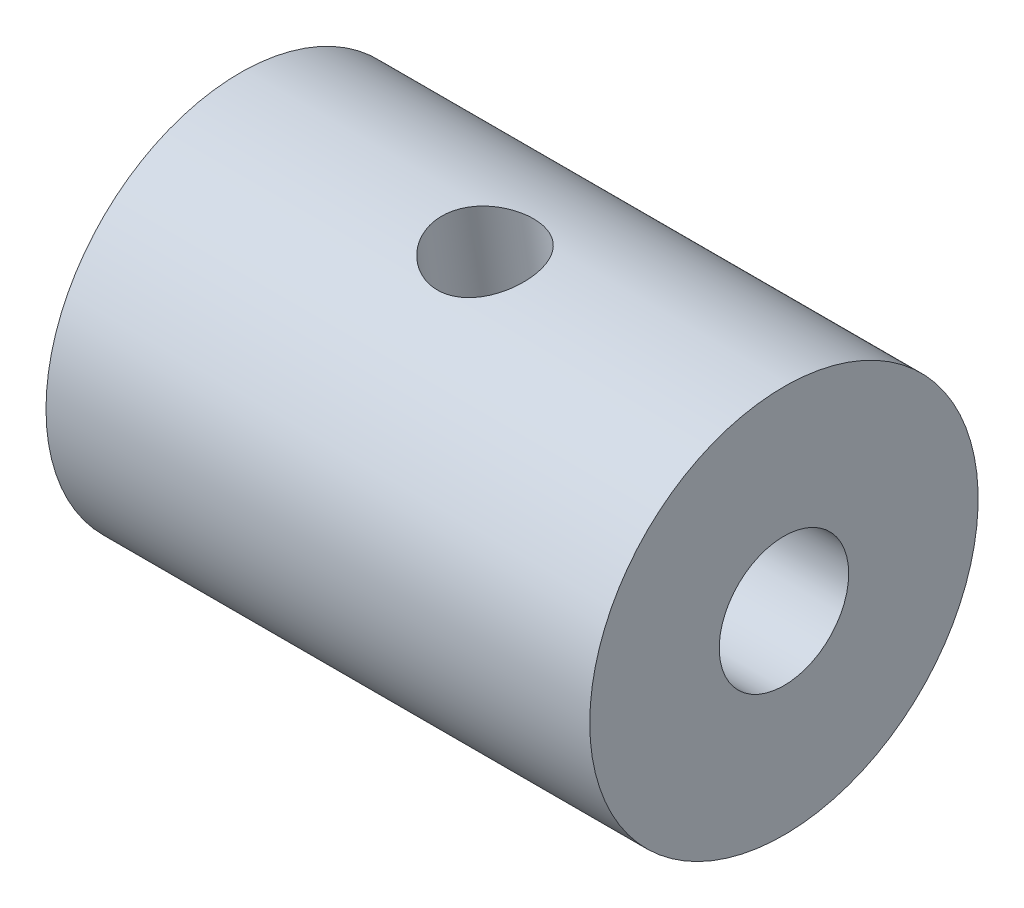
ISO-10303-21;
HEADER;
FILE_DESCRIPTION(('STEP AP214'),'2;1');
FILE_NAME('part.step','',(''),(''),'','','');
FILE_SCHEMA(('AUTOMOTIVE_DESIGN { 1 0 10303 214 1 1 1 1 }'));
ENDSEC;
DATA;
#1=APPLICATION_CONTEXT('core data for automotive mechanical design processes');
#2=APPLICATION_PROTOCOL_DEFINITION('international standard','automotive_design',2000,#1);
#3=PRODUCT_CONTEXT('',#1,'mechanical');
#4=PRODUCT('Part','Part','',(#3));
#5=PRODUCT_RELATED_PRODUCT_CATEGORY('part','',(#4));
#6=PRODUCT_DEFINITION_FORMATION('','',#4);
#7=PRODUCT_DEFINITION_CONTEXT('part definition',#1,'design');
#8=PRODUCT_DEFINITION('design','',#6,#7);
#9=PRODUCT_DEFINITION_SHAPE('','',#8);
#10=(LENGTH_UNIT() NAMED_UNIT(*) SI_UNIT(.MILLI.,.METRE.));
#11=(NAMED_UNIT(*) PLANE_ANGLE_UNIT() SI_UNIT($,.RADIAN.));
#12=(NAMED_UNIT(*) SI_UNIT($,.STERADIAN.) SOLID_ANGLE_UNIT());
#13=UNCERTAINTY_MEASURE_WITH_UNIT(LENGTH_MEASURE(1.E-05),#10,'distance_accuracy_value','');
#14=(GEOMETRIC_REPRESENTATION_CONTEXT(3) GLOBAL_UNCERTAINTY_ASSIGNED_CONTEXT((#13)) GLOBAL_UNIT_ASSIGNED_CONTEXT((#10,
#11,#12)) REPRESENTATION_CONTEXT('',''));
#15=CARTESIAN_POINT('',(0.,0.,0.));
#16=DIRECTION('',(0.,0.,1.));
#17=DIRECTION('',(1.,0.,0.));
#18=AXIS2_PLACEMENT_3D('',#15,#16,#17);
#19=CARTESIAN_POINT('',(77.7999999999986,625.40311228623,-417.857743681072));
#20=DIRECTION('',(1.,0.,0.));
#21=DIRECTION('',(0.,0.,-1.));
#22=AXIS2_PLACEMENT_3D('',#19,#20,#21);
#23=CYLINDRICAL_SURFACE('',#22,0.999999999999833);
#24=CARTESIAN_POINT('',(77.7999999999986,625.40311228623,-417.857743681072));
#25=DIRECTION('',(1.,0.,0.));
#26=DIRECTION('',(0.,0.,-1.));
#27=AXIS2_PLACEMENT_3D('',#24,#25,#26);
#28=CIRCLE('',#27,0.999999999999833);
#29=CARTESIAN_POINT('',(77.7999999999986,625.40311228623,-418.857743681072));
#30=VERTEX_POINT('',#29);
#31=EDGE_CURVE('E70',#30,#30,#28,.T.);
#32=ORIENTED_EDGE('',*,*,#31,.F.);
#33=EDGE_LOOP('',(#32));
#34=FACE_BOUND('',#33,.T.);
#35=CARTESIAN_POINT('',(81.2499999999985,626.393011866566,-417.715973370885));
#36=CARTESIAN_POINT('',(81.2500048845506,626.387816575153,-417.679730081788));
#37=CARTESIAN_POINT('',(81.2527028403194,626.380611686461,-417.64372410393));
#38=CARTESIAN_POINT('',(81.2633318807977,626.36252467603,-417.573393158187));
#39=CARTESIAN_POINT('',(81.2712767691581,626.351632891734,-417.539072881622));
#40=CARTESIAN_POINT('',(81.2918568135322,626.326914811286,-417.473274282663));
#41=CARTESIAN_POINT('',(81.3044632499259,626.313106701358,-417.441779995941));
#42=CARTESIAN_POINT('',(81.3337717143091,626.283300302151,-417.38194121829));
#43=CARTESIAN_POINT('',(81.3504723997276,626.26730273159,-417.353595699248));
#44=CARTESIAN_POINT('',(81.3891314254881,626.232351428471,-417.297793605723));
#45=CARTESIAN_POINT('',(81.4114334597181,626.213261130766,-417.270662515316));
#46=CARTESIAN_POINT('',(81.4597476714206,626.174388330139,-417.220449361895));
#47=CARTESIAN_POINT('',(81.4857656108342,626.154604788903,-417.197373713631));
#48=CARTESIAN_POINT('',(81.5467915096183,626.111427094647,-417.151001440495));
#49=CARTESIAN_POINT('',(81.5825519064801,626.088116265569,-417.128612987354));
#50=CARTESIAN_POINT('',(81.6587255820782,626.044270946338,-417.089779633551));
#51=CARTESIAN_POINT('',(81.6991323885849,626.023732678847,-417.073326594281));
#52=CARTESIAN_POINT('',(81.7697514249271,625.994647765094,-417.051333288142));
#53=CARTESIAN_POINT('',(81.79869536009,625.984405648087,-417.043985869656));
#54=CARTESIAN_POINT('',(81.8581963795788,625.967644432871,-417.032268775681));
#55=CARTESIAN_POINT('',(81.8887495951811,625.961116814603,-417.027892281203));
#56=CARTESIAN_POINT('',(81.9510912641387,625.952744319238,-417.022319939194));
#57=CARTESIAN_POINT('',(81.9828883451078,625.950942012572,-417.021153002059));
#58=CARTESIAN_POINT('',(82.0463073975171,625.952500316394,-417.022176115647));
#59=CARTESIAN_POINT('',(82.0779293017383,625.955862787293,-417.02436737603));
#60=CARTESIAN_POINT('',(82.1365957174612,625.966509376024,-417.031536976128));
#61=CARTESIAN_POINT('',(82.1637682712988,625.973336018831,-417.03619245829));
#62=CARTESIAN_POINT('',(82.2167195208759,625.989791735279,-417.047861474921));
#63=CARTESIAN_POINT('',(82.2424968536255,625.999423492661,-417.054877268577));
#64=CARTESIAN_POINT('',(82.3081283443233,626.027324830545,-417.076189582305));
#65=CARTESIAN_POINT('',(82.3467004939663,626.047228627485,-417.092295127816));
#66=CARTESIAN_POINT('',(82.4195985205638,626.089538009842,-417.129988351715));
#67=CARTESIAN_POINT('',(82.4539137989757,626.111949585459,-417.151589320361));
#68=CARTESIAN_POINT('',(82.5188742353395,626.15786407924,-417.200847149261));
#69=CARTESIAN_POINT('',(82.5494057164576,626.181380270971,-417.228642346256));
#70=CARTESIAN_POINT('',(82.6051280733626,626.227179052026,-417.289964334866));
#71=CARTESIAN_POINT('',(82.6303283864811,626.249463768762,-417.323480805203));
#72=CARTESIAN_POINT('',(82.6699986312418,626.28695687894,-417.388766391233));
#73=CARTESIAN_POINT('',(82.6856067770825,626.30268871818,-417.419541595384));
#74=CARTESIAN_POINT('',(82.7121230026604,626.331407129498,-417.484227453326));
#75=CARTESIAN_POINT('',(82.7230384110854,626.344397965945,-417.518133116901));
#76=CARTESIAN_POINT('',(82.7374579930122,626.363967022742,-417.579333934648));
#77=CARTESIAN_POINT('',(82.7421434608892,626.371335586092,-417.606103039053));
#78=CARTESIAN_POINT('',(82.7484153705992,626.383866688366,-417.660512496051));
#79=CARTESIAN_POINT('',(82.7500016622642,626.389029120384,-417.688152890795));
#80=CARTESIAN_POINT('',(82.7499978315724,626.398207360422,-417.752265197374));
#81=CARTESIAN_POINT('',(82.7472934082658,626.401395357873,-417.788863478914));
#82=CARTESIAN_POINT('',(82.7366544341147,626.403766485783,-417.861433438673));
#83=CARTESIAN_POINT('',(82.7287146197777,626.402945580495,-417.897404448858));
#84=CARTESIAN_POINT('',(82.7081452962361,626.397692585325,-417.967463110696));
#85=CARTESIAN_POINT('',(82.6955415131832,626.393280148848,-418.001559936824));
#86=CARTESIAN_POINT('',(82.6662344673994,626.381468170713,-418.067359536654));
#87=CARTESIAN_POINT('',(82.6495310211331,626.374068495311,-418.099062203091));
#88=CARTESIAN_POINT('',(82.6108678261684,626.356182601437,-418.162438317533));
#89=CARTESIAN_POINT('',(82.5885648827799,626.345474266062,-418.193838063676));
#90=CARTESIAN_POINT('',(82.5402502957325,626.322257591408,-418.252943106282));
#91=CARTESIAN_POINT('',(82.5142331701943,626.309746591259,-418.280642822657));
#92=CARTESIAN_POINT('',(82.4532117660105,626.281322016785,-418.337266229201));
#93=CARTESIAN_POINT('',(82.4174554953008,626.265233562282,-418.365295256726));
#94=CARTESIAN_POINT('',(82.3412811344146,626.234050491082,-418.414874970213));
#95=CARTESIAN_POINT('',(82.3008686515711,626.218954712661,-418.436433338043));
#96=CARTESIAN_POINT('',(82.2299734980262,626.19712434928,-418.465823093376));
#97=CARTESIAN_POINT('',(82.2007376052727,626.189286823753,-418.475831946807));
#98=CARTESIAN_POINT('',(82.1406402028207,626.176426706061,-418.491851157142));
#99=CARTESIAN_POINT('',(82.1097850732088,626.171393858247,-418.497876097004));
#100=CARTESIAN_POINT('',(82.0655214327795,626.166886459299,-418.503229973255));
#101=CARTESIAN_POINT('',(82.0524693465091,626.16588272949,-418.504414123985));
#102=CARTESIAN_POINT('',(82.026281022793,626.164536360401,-418.505998362604));
#103=CARTESIAN_POINT('',(82.013144763028,626.164193904411,-418.506398233107));
#104=CARTESIAN_POINT('',(81.9650341732785,626.164205406448,-418.506390500157));
#105=CARTESIAN_POINT('',(81.9300081782553,626.166659189061,-418.503540483813));
#106=CARTESIAN_POINT('',(81.8613543700135,626.175854169823,-418.49250016541));
#107=CARTESIAN_POINT('',(81.8277322412016,626.182611279254,-418.484290041845));
#108=CARTESIAN_POINT('',(81.7632095114856,626.198899126599,-418.463461345449));
#109=CARTESIAN_POINT('',(81.7322772266039,626.20838942158,-418.450906550532));
#110=CARTESIAN_POINT('',(81.6728234327271,626.228885083881,-418.422024596851));
#111=CARTESIAN_POINT('',(81.6443013420605,626.23989008395,-418.405698351853));
#112=CARTESIAN_POINT('',(81.5839430764649,626.264746580776,-418.365921497186));
#113=CARTESIAN_POINT('',(81.5526648176565,626.27871132974,-418.341694883806));
#114=CARTESIAN_POINT('',(81.4937361291905,626.305944409964,-418.288769305694));
#115=CARTESIAN_POINT('',(81.466091001076,626.319211706927,-418.260063936081));
#116=CARTESIAN_POINT('',(81.4095775010855,626.346365377202,-418.192209657688));
#117=CARTESIAN_POINT('',(81.3816094302925,626.359826213859,-418.152124789362));
#118=CARTESIAN_POINT('',(81.3326983488308,626.382028815602,-418.066686304748));
#119=CARTESIAN_POINT('',(81.3117418987071,626.390779628415,-418.021342994903));
#120=CARTESIAN_POINT('',(81.2833879515749,626.400184397872,-417.941145563671));
#121=CARTESIAN_POINT('',(81.2738076237141,626.402483463764,-417.907247034778));
#122=CARTESIAN_POINT('',(81.2593044542098,626.403512653347,-417.838469828234));
#123=CARTESIAN_POINT('',(81.2543676684104,626.402253507936,-417.803594411023));
#124=CARTESIAN_POINT('',(81.2506269369176,626.397572739336,-417.751134776349));
#125=CARTESIAN_POINT('',(81.2499976343767,626.395527981572,-417.733526242575));
#126=CARTESIAN_POINT('',(81.2499999999985,626.393011866566,-417.715973370885));
#127=B_SPLINE_CURVE_WITH_KNOTS('',3,(#35,#36,#37,#38,#39,#40,#41,#42,#43,#44,#45,#46,#47,#48,
#49,#50,#51,#52,#53,#54,#55,#56,#57,#58,#59,#60,#61,#62,#63,#64,#65,#66,#67,#68,#69,#70,#71,#72,
#73,#74,#75,#76,#77,#78,#79,#80,#81,#82,#83,#84,#85,#86,#87,#88,#89,#90,#91,#92,#93,#94,#95,#96,
#97,#98,#99,#100,#101,#102,#103,#104,#105,#106,#107,#108,#109,#110,#111,#112,#113,#114,#115,
#116,#117,#118,#119,#120,#121,#122,#123,#124,#125,#126),.UNSPECIFIED.,.T.,.F.,(4,2,2,2,2,2,2,2,
2,2,2,2,2,2,2,2,2,2,2,2,2,2,2,2,2,2,2,2,2,2,2,2,2,2,2,2,2,2,2,2,2,2,2,2,2,4),(0.,
0.109779098610894,0.219848161169007,0.329250094068518,0.438616200163043,0.558111599137663,
0.677794342893487,0.821800215780414,0.965607871232601,1.05999761233465,1.15416996693883,
1.24918785242932,1.3442399724726,1.42913458582808,1.51411068885054,1.65224717459531,
1.79072096237719,1.93266884602563,2.07436330844417,2.18768580001679,2.30083066627423,
2.38504944966768,2.46927231371275,2.57914107077508,2.68912045508984,2.79850202951175,
2.90788850166432,3.0273884559495,3.14706664334605,3.29105921757458,3.43488016359618,
3.53020422074197,3.62517738737282,3.66457445599748,3.7039824431124,3.80880995850997,
3.91402733535254,4.01776145273745,4.12147046320112,4.2469110147062,4.37253262606157,
4.52377308917098,4.67472198031485,4.78019317467399,4.8853466273902,4.93851339233347),.UNSPECIFIED.);
#128=CARTESIAN_POINT('',(81.2499999999985,626.393011866566,-417.715973370885));
#129=VERTEX_POINT('',#128);
#130=EDGE_CURVE('E19',#129,#129,#127,.T.);
#131=ORIENTED_EDGE('',*,*,#130,.T.);
#132=EDGE_LOOP('',(#131));
#133=FACE_BOUND('',#132,.T.);
#134=CARTESIAN_POINT('',(86.1999999999986,625.40311228623,-417.857743681072));
#135=DIRECTION('',(1.,0.,0.));
#136=DIRECTION('',(0.,0.,-1.));
#137=AXIS2_PLACEMENT_3D('',#134,#135,#136);
#138=CIRCLE('',#137,0.999999999999833);
#139=CARTESIAN_POINT('',(86.1999999999986,625.40311228623,-418.857743681072));
#140=VERTEX_POINT('',#139);
#141=EDGE_CURVE('E54',#140,#140,#138,.F.);
#142=ORIENTED_EDGE('',*,*,#141,.F.);
#143=EDGE_LOOP('',(#142));
#144=FACE_BOUND('',#143,.T.);
#145=CARTESIAN_POINT('',(81.9999999999987,624.854682990746,-418.693940612336));
#146=CARTESIAN_POINT('',(82.0349658267189,624.854673389876,-418.693937564401));
#147=CARTESIAN_POINT('',(82.0699918217421,624.851518310237,-418.6918908317));
#148=CARTESIAN_POINT('',(82.1386456299838,624.839594185427,-418.683875125295));
#149=CARTESIAN_POINT('',(82.1722677587958,624.830804305134,-418.677891592791));
#150=CARTESIAN_POINT('',(82.2367904885117,624.809325060214,-418.662471780782));
#151=CARTESIAN_POINT('',(82.2677227733935,624.796692413788,-418.65308536408));
#152=CARTESIAN_POINT('',(82.3271765672703,624.76891413614,-418.631117052526));
#153=CARTESIAN_POINT('',(82.355698657937,624.75376911388,-418.61853593163));
#154=CARTESIAN_POINT('',(82.4160569235325,624.718747351668,-418.58733465324));
#155=CARTESIAN_POINT('',(82.4473351823409,624.698544105787,-418.568001472814));
#156=CARTESIAN_POINT('',(82.5062638708068,624.657550752378,-418.524847070336));
#157=CARTESIAN_POINT('',(82.5339089989214,624.636759839869,-418.50101941056));
#158=CARTESIAN_POINT('',(82.5904224989119,624.591652565373,-418.44351411782));
#159=CARTESIAN_POINT('',(82.6183905697048,624.567481932395,-418.408818710435));
#160=CARTESIAN_POINT('',(82.6673016511665,624.522191227454,-418.333046405314));
#161=CARTESIAN_POINT('',(82.6882581012901,624.501065364241,-418.291981939214));
#162=CARTESIAN_POINT('',(82.7166120484224,624.469529090692,-418.21764795563));
#163=CARTESIAN_POINT('',(82.7261923762831,624.457807913209,-418.185757361978));
#164=CARTESIAN_POINT('',(82.7406955457873,624.437515932425,-418.120033706518));
#165=CARTESIAN_POINT('',(82.7456323315868,624.428935744711,-418.086206786002));
#166=CARTESIAN_POINT('',(82.7493730630795,624.418704158152,-418.03454212205));
#167=CARTESIAN_POINT('',(82.7500023656204,624.415724415601,-418.017067493862));
#168=CARTESIAN_POINT('',(82.7499951154466,624.408026510573,-417.963269399448));
#169=CARTESIAN_POINT('',(82.7472971596778,624.404835739205,-417.926688532309));
#170=CARTESIAN_POINT('',(82.7366681191996,624.402455433821,-417.854108121579));
#171=CARTESIAN_POINT('',(82.7287232308392,624.403276490694,-417.818110368674));
#172=CARTESIAN_POINT('',(82.7081431864651,624.408532826274,-417.748018927954));
#173=CARTESIAN_POINT('',(82.6955367500715,624.412946168986,-417.713915021989));
#174=CARTESIAN_POINT('',(82.6662282856884,624.424759068133,-417.648115659088));
#175=CARTESIAN_POINT('',(82.6495276002699,624.432157646175,-417.616419417094));
#176=CARTESIAN_POINT('',(82.6108685745096,624.450041639576,-417.553050418273));
#177=CARTESIAN_POINT('',(82.5885665402796,624.460749486296,-417.52165173117));
#178=CARTESIAN_POINT('',(82.5402523285772,624.483966027748,-417.462546337101));
#179=CARTESIAN_POINT('',(82.5142343891636,624.496477519528,-417.434845495596));
#180=CARTESIAN_POINT('',(82.4532084903796,624.524903953799,-417.378218303968));
#181=CARTESIAN_POINT('',(82.4174480935178,624.540993824455,-417.350187006306));
#182=CARTESIAN_POINT('',(82.3412744179198,624.572177046062,-417.30060830043));
#183=CARTESIAN_POINT('',(82.3008676114132,624.587271738191,-417.27905202055));
#184=CARTESIAN_POINT('',(82.230248575071,624.609014497509,-417.249779334643));
#185=CARTESIAN_POINT('',(82.2013046399082,624.61678265609,-417.239852541029));
#186=CARTESIAN_POINT('',(82.1418036204193,624.62958139423,-417.223901963335));
#187=CARTESIAN_POINT('',(82.1112504048171,624.634618237431,-417.217869242992));
#188=CARTESIAN_POINT('',(82.0489087358594,624.641090151431,-417.210170931276));
#189=CARTESIAN_POINT('',(82.0171116548903,624.642492477507,-417.2085450367));
#190=CARTESIAN_POINT('',(81.9536926024809,624.641283978012,-417.209964403173));
#191=CARTESIAN_POINT('',(81.9220706982596,624.638671706336,-417.213011347431));
#192=CARTESIAN_POINT('',(81.8634042825367,624.630465425356,-417.222880996342));
#193=CARTESIAN_POINT('',(81.8362317286991,624.625219883052,-417.229265418956));
#194=CARTESIAN_POINT('',(81.783280479122,624.612700869157,-417.245084105503));
#195=CARTESIAN_POINT('',(81.7575031463725,624.605425455807,-417.254521291072));
#196=CARTESIAN_POINT('',(81.6918716556747,624.584627556669,-417.282808156639));
#197=CARTESIAN_POINT('',(81.6532995060316,624.570044297455,-417.303852830063));
#198=CARTESIAN_POINT('',(81.5804014794342,624.540015263737,-417.351906134811));
#199=CARTESIAN_POINT('',(81.5460862010223,624.524567470091,-417.378929203467));
#200=CARTESIAN_POINT('',(81.4811257646585,624.49432415757,-417.439094114293));
#201=CARTESIAN_POINT('',(81.4505942835404,624.4795547266,-417.472372457978));
#202=CARTESIAN_POINT('',(81.3948719266353,624.452808604457,-417.544084099874));
#203=CARTESIAN_POINT('',(81.3696716135168,624.440826974448,-417.582508088816));
#204=CARTESIAN_POINT('',(81.330001368756,624.423165144408,-417.655692792229));
#205=CARTESIAN_POINT('',(81.3143932229151,624.416703572014,-417.68964646712));
#206=CARTESIAN_POINT('',(81.2878769973371,624.407295388907,-417.75979269622));
#207=CARTESIAN_POINT('',(81.2769615889121,624.404343284606,-417.795981657718));
#208=CARTESIAN_POINT('',(81.2625420069851,624.402738503822,-417.86021492601));
#209=CARTESIAN_POINT('',(81.257856539108,624.403179604328,-417.887976159895));
#210=CARTESIAN_POINT('',(81.2515846293979,624.406423691889,-417.943715673985));
#211=CARTESIAN_POINT('',(81.2499983377329,624.409226793384,-417.971693964641));
#212=CARTESIAN_POINT('',(81.2500021684247,624.418412330226,-418.035805226194));
#213=CARTESIAN_POINT('',(81.2527065917314,624.425624769148,-418.071827139861));
#214=CARTESIAN_POINT('',(81.2633455658825,624.443717654796,-418.142145478835));
#215=CARTESIAN_POINT('',(81.2712853802196,624.454601787541,-418.176440130219));
#216=CARTESIAN_POINT('',(81.2918547037612,624.479307461585,-418.242208205506));
#217=CARTESIAN_POINT('',(81.3044584868142,624.493112714561,-418.273695951343));
#218=CARTESIAN_POINT('',(81.3337655325981,624.522918296279,-418.333535214905));
#219=CARTESIAN_POINT('',(81.3504689788644,624.53891872328,-418.361886592139));
#220=CARTESIAN_POINT('',(81.3891321738292,624.573873847667,-418.417694981835));
#221=CARTESIAN_POINT('',(81.4114351172177,624.592964911632,-418.444826951557));
#222=CARTESIAN_POINT('',(81.4597497042651,624.63183774146,-418.495039730257));
#223=CARTESIAN_POINT('',(81.4857668298035,624.651620495029,-418.518114436608));
#224=CARTESIAN_POINT('',(81.5467882339873,624.694795341863,-418.564483598813));
#225=CARTESIAN_POINT('',(81.5825445046971,624.718104174539,-418.586870270553));
#226=CARTESIAN_POINT('',(81.6587188655833,624.761949632223,-418.625704633678));
#227=CARTESIAN_POINT('',(81.6991313484269,624.782489528378,-418.642159372072));
#228=CARTESIAN_POINT('',(81.7700265019719,624.811691383382,-418.664240453298));
#229=CARTESIAN_POINT('',(81.7992623947253,624.82202311123,-418.671647163302));
#230=CARTESIAN_POINT('',(81.8593597971774,624.83886250227,-418.683412903236));
#231=CARTESIAN_POINT('',(81.8902149267892,624.845384101957,-418.687783051401));
#232=CARTESIAN_POINT('',(81.9344785672184,624.851213022635,-418.691656592404));
#233=CARTESIAN_POINT('',(81.9475306534887,624.852508768441,-418.692511419456));
#234=CARTESIAN_POINT('',(81.9737189772046,624.854245675601,-418.69365408093));
#235=CARTESIAN_POINT('',(81.9868552369695,624.854686600017,-418.693941758151));
#236=CARTESIAN_POINT('',(81.9999999999987,624.854682990746,-418.693940612336));
#237=B_SPLINE_CURVE_WITH_KNOTS('',3,(#145,#146,#147,#148,#149,#150,#151,#152,#153,#154,#155,
#156,#157,#158,#159,#160,#161,#162,#163,#164,#165,#166,#167,#168,#169,#170,#171,#172,#173,#174,
#175,#176,#177,#178,#179,#180,#181,#182,#183,#184,#185,#186,#187,#188,#189,#190,#191,#192,#193,
#194,#195,#196,#197,#198,#199,#200,#201,#202,#203,#204,#205,#206,#207,#208,#209,#210,#211,#212,
#213,#214,#215,#216,#217,#218,#219,#220,#221,#222,#223,#224,#225,#226,#227,#228,#229,#230,#231,
#232,#233,#234,#235,#236),.UNSPECIFIED.,.T.,.F.,(4,2,2,2,2,2,2,2,2,2,2,2,2,2,2,2,2,2,2,2,2,2,2,
2,2,2,2,2,2,2,2,2,2,2,2,2,2,2,2,2,2,2,2,2,2,4),(0.,0.104827515397551,0.210044892240132,
0.313779009625187,0.417488020088867,0.542928571593924,0.668550182949298,0.819790646058636,
0.970739537202536,1.07621073156154,1.1813641842778,1.23453094922018,1.34431004783098,
1.45437911038897,1.56378104328854,1.67314714938293,1.7926425483575,1.91232529211322,
2.05633116500019,2.20013882045227,2.29452856155437,2.38870091615866,2.48371880164924,
2.57877092169264,2.6636655350481,2.74864163807051,2.88677812381513,3.02525191159684,
3.16719979524519,3.30889425766356,3.42221674923625,3.53536161549385,3.61958039888831,
3.70380326293426,3.81367201999672,3.92365140431154,4.03303297873351,4.14241945088608,
4.26191940517122,4.3815975925679,4.52559016679646,4.66941111281817,4.76473516996388,
4.85970833659465,4.89910540521901,4.93851339233356),.UNSPECIFIED.);
#238=CARTESIAN_POINT('',(81.9999999999987,624.854682990746,-418.693940612336));
#239=VERTEX_POINT('',#238);
#240=EDGE_CURVE('E65',#239,#239,#237,.T.);
#241=ORIENTED_EDGE('',*,*,#240,.T.);
#242=EDGE_LOOP('',(#241));
#243=FACE_BOUND('',#242,.T.);
#244=ADVANCED_FACE('F15',(#34,#133,#144,#243),#23,.F.);
#245=CARTESIAN_POINT('',(81.9999999999986,628.475473570355,-417.417729743387));
#246=DIRECTION('',(0.,-0.989899580336077,-0.141770310186794));
#247=DIRECTION('',(0.,0.141770310186794,-0.989899580336077));
#248=AXIS2_PLACEMENT_3D('',#245,#246,#247);
#249=CYLINDRICAL_SURFACE('',#248,0.750000000000018);
#250=CARTESIAN_POINT('',(81.9999999999986,628.384838460665,-418.188362828568));
#251=CARTESIAN_POINT('',(82.0414272520416,628.384838856408,-418.188362061246));
#252=CARTESIAN_POINT('',(82.0828622086161,628.38523687744,-418.184827510478));
#253=CARTESIAN_POINT('',(82.1645288235233,628.386739773286,-418.170817768395));
#254=CARTESIAN_POINT('',(82.2047603283399,628.387844737881,-418.160341695511));
#255=CARTESIAN_POINT('',(82.2792922132979,628.390382660403,-418.134096704128));
#256=CARTESIAN_POINT('',(82.3137979806832,628.391776178716,-418.118902198232));
#257=CARTESIAN_POINT('',(82.3801377331408,628.394657006062,-418.083519403028));
#258=CARTESIAN_POINT('',(82.4119716413375,628.396144317792,-418.0633309701));
#259=CARTESIAN_POINT('',(82.4763213142912,628.399071339412,-418.015466650798));
#260=CARTESIAN_POINT('',(82.5083659608637,628.400478483494,-417.987152401973));
#261=CARTESIAN_POINT('',(82.5673346079756,628.402503461591,-417.925568356241));
#262=CARTESIAN_POINT('',(82.5942558371402,628.403120869447,-417.892295894574));
#263=CARTESIAN_POINT('',(82.6422374918769,628.403103522878,-417.821721582112));
#264=CARTESIAN_POINT('',(82.6632932448468,628.402467773389,-417.784416551509));
#265=CARTESIAN_POINT('',(82.69886399142,628.399567362139,-417.70689297275));
#266=CARTESIAN_POINT('',(82.7133852940267,628.397304277077,-417.666677278585));
#267=CARTESIAN_POINT('',(82.7328820713022,628.391668523043,-417.594043858255));
#268=CARTESIAN_POINT('',(82.7392884367596,628.388673442539,-417.561973324736));
#269=CARTESIAN_POINT('',(82.7478478938911,628.381568409307,-417.497390656319));
#270=CARTESIAN_POINT('',(82.7500011312827,628.377458494779,-417.464878536588));
#271=CARTESIAN_POINT('',(82.7499985699584,628.36693622906,-417.391418489891));
#272=CARTESIAN_POINT('',(82.7465546458669,628.360202467849,-417.350510224689));
#273=CARTESIAN_POINT('',(82.7328889446097,628.345279692354,-417.270098185794));
#274=CARTESIAN_POINT('',(82.7226623667921,628.337089650346,-417.230595427777));
#275=CARTESIAN_POINT('',(82.6957801548834,628.319699100555,-417.154140720034));
#276=CARTESIAN_POINT('',(82.6791326019994,628.310499873268,-417.11718563254));
#277=CARTESIAN_POINT('',(82.6399086423399,628.291633392087,-417.046708218504));
#278=CARTESIAN_POINT('',(82.6173322104888,628.281966136214,-417.013185906481));
#279=CARTESIAN_POINT('',(82.5663996733793,628.262609227528,-416.949780238653));
#280=CARTESIAN_POINT('',(82.5379443656925,628.252922469347,-416.919975681735));
#281=CARTESIAN_POINT('',(82.4762740767428,628.234400428248,-416.865454214663));
#282=CARTESIAN_POINT('',(82.4430585332361,628.225565246118,-416.840737906337));
#283=CARTESIAN_POINT('',(82.3722023557579,628.209302353775,-416.796678753201));
#284=CARTESIAN_POINT('',(82.334503319669,628.201897499822,-416.777421180225));
#285=CARTESIAN_POINT('',(82.256125724237,628.189291504269,-416.745311681383));
#286=CARTESIAN_POINT('',(82.215447647565,628.184090006598,-416.73245872045));
#287=CARTESIAN_POINT('',(82.1331282850798,628.176440089819,-416.713735767824));
#288=CARTESIAN_POINT('',(82.0915226218469,628.173938604147,-416.707731040378));
#289=CARTESIAN_POINT('',(82.0078157860765,628.171734907884,-416.702435204214));
#290=CARTESIAN_POINT('',(81.9657146944159,628.172032246558,-416.703143014476));
#291=CARTESIAN_POINT('',(81.8832922193732,628.1753558339,-416.711147474895));
#292=CARTESIAN_POINT('',(81.8429524339361,628.178315754723,-416.718283985158));
#293=CARTESIAN_POINT('',(81.7641197085237,628.186614718108,-416.738710800959));
#294=CARTESIAN_POINT('',(81.7256269115457,628.191953944553,-416.752001582127));
#295=CARTESIAN_POINT('',(81.6511297374286,628.204635682724,-416.784536824142));
#296=CARTESIAN_POINT('',(81.6151545022292,628.211997930693,-416.803840204483));
#297=CARTESIAN_POINT('',(81.5470384802864,628.228124080355,-416.847864307528));
#298=CARTESIAN_POINT('',(81.5148981085601,628.236888133515,-416.872585615752));
#299=CARTESIAN_POINT('',(81.4544043291213,628.255438710281,-416.927636354256));
#300=CARTESIAN_POINT('',(81.4261840782211,628.265247173726,-416.95810487906));
#301=CARTESIAN_POINT('',(81.37539838182,628.284967977229,-417.023435473374));
#302=CARTESIAN_POINT('',(81.3528353701154,628.294880360091,-417.058299424177));
#303=CARTESIAN_POINT('',(81.313956312014,628.314174329104,-417.131683870905));
#304=CARTESIAN_POINT('',(81.2976668279196,628.323553518015,-417.170219071183));
#305=CARTESIAN_POINT('',(81.272022875006,628.341132935765,-417.249728087071));
#306=CARTESIAN_POINT('',(81.2626539757558,628.34933558889,-417.290696634846));
#307=CARTESIAN_POINT('',(81.2545977242626,628.3596760924,-417.348807362413));
#308=CARTESIAN_POINT('',(81.2528752299716,628.3624934132,-417.365453435145));
#309=CARTESIAN_POINT('',(81.2505759430745,628.367858336492,-417.398867701785));
#310=CARTESIAN_POINT('',(81.2499991385915,628.370405941779,-417.415635894425));
#311=CARTESIAN_POINT('',(81.2500021011097,628.378677419796,-417.473403000098));
#312=CARTESIAN_POINT('',(81.2534410313528,628.383695889177,-417.514543783152));
#313=CARTESIAN_POINT('',(81.2670979885755,628.391946596169,-417.595923078009));
#314=CARTESIAN_POINT('',(81.2773294107912,628.395175281075,-417.636159644214));
#315=CARTESIAN_POINT('',(81.3042247692308,628.399944916552,-417.714458983186));
#316=CARTESIAN_POINT('',(81.3208790414374,628.401488389442,-417.752524923641));
#317=CARTESIAN_POINT('',(81.3601103258421,628.403160530072,-417.825465706802));
#318=CARTESIAN_POINT('',(81.3826827485611,628.403290290831,-417.860342994141));
#319=CARTESIAN_POINT('',(81.4293511270808,628.402573854135,-417.921085591273));
#320=CARTESIAN_POINT('',(81.4527156906921,628.401870563061,-417.947518825128));
#321=CARTESIAN_POINT('',(81.5028494940511,628.399984197702,-417.996919722805));
#322=CARTESIAN_POINT('',(81.5296192775531,628.398801046726,-418.019886831866));
#323=CARTESIAN_POINT('',(81.5913640831456,628.395992680678,-418.06581038704));
#324=CARTESIAN_POINT('',(81.6269381281429,628.394326173254,-418.087965318981));
#325=CARTESIAN_POINT('',(81.7012913790007,628.391152360296,-418.126041930522));
#326=CARTESIAN_POINT('',(81.740070650022,628.389645057999,-418.141963483361));
#327=CARTESIAN_POINT('',(81.815452013254,628.387287761458,-418.165676675507));
#328=CARTESIAN_POINT('',(81.8518353983273,628.386384277939,-418.174161784722));
#329=CARTESIAN_POINT('',(81.9254771718738,628.385159479823,-418.185504913781));
#330=CARTESIAN_POINT('',(81.9627354689469,628.384838104687,-418.188363518788));
#331=CARTESIAN_POINT('',(81.9999999999986,628.384838460665,-418.188362828568));
#332=B_SPLINE_CURVE_WITH_KNOTS('',3,(#250,#251,#252,#253,#254,#255,#256,#257,#258,#259,#260,
#261,#262,#263,#264,#265,#266,#267,#268,#269,#270,#271,#272,#273,#274,#275,#276,#277,#278,#279,
#280,#281,#282,#283,#284,#285,#286,#287,#288,#289,#290,#291,#292,#293,#294,#295,#296,#297,#298,
#299,#300,#301,#302,#303,#304,#305,#306,#307,#308,#309,#310,#311,#312,#313,#314,#315,#316,#317,
#318,#319,#320,#321,#322,#323,#324,#325,#326,#327,#328,#329,#330,#331),.UNSPECIFIED.,.T.,.F.,(4,
2,2,2,2,2,2,2,2,2,2,2,2,2,2,2,2,2,2,2,2,2,2,2,2,2,2,2,2,2,2,2,2,2,2,2,2,2,2,2,4),(0.,
0.12414647577693,0.248308721108647,0.361068657170299,0.473831836490504,0.601573607053626,
0.729384280904409,0.85729648302171,0.985084919691381,1.08332375138453,1.18155921723563,
1.3057372842735,1.4300033364555,1.55411349953895,1.67822418754223,1.8046310551628,
1.93105286535419,2.05935256514734,2.18763152330959,2.31334058789319,2.43902940802363,
2.56167133146995,2.68432273481488,2.80821600521721,2.93212267147225,3.05954130624779,
3.18701466399766,3.31502196476747,3.44276159227545,3.49363997883916,3.54451783795871,
3.66861716796662,3.79296195980216,3.91712038402416,4.04118280769967,4.14671102933316,
4.25225612318678,4.37749371566264,4.50273385478268,4.61441737678058,4.72608928291503),.UNSPECIFIED.);
#333=CARTESIAN_POINT('',(81.9999999999986,628.384838460665,-418.188362828568));
#334=VERTEX_POINT('',#333);
#335=EDGE_CURVE('E48',#334,#334,#332,.T.);
#336=ORIENTED_EDGE('',*,*,#335,.F.);
#337=EDGE_LOOP('',(#336));
#338=FACE_BOUND('',#337,.T.);
#339=ORIENTED_EDGE('',*,*,#130,.F.);
#340=EDGE_LOOP('',(#339));
#341=FACE_BOUND('',#340,.T.);
#342=ADVANCED_FACE('F56',(#338,#341),#249,.F.);
#343=CARTESIAN_POINT('',(77.7999999999986,625.40311228623,-417.857743681072));
#344=DIRECTION('',(-1.,0.,0.));
#345=DIRECTION('',(0.,0.,1.));
#346=AXIS2_PLACEMENT_3D('',#343,#344,#345);
#347=PLANE('',#346);
#348=ORIENTED_EDGE('',*,*,#31,.T.);
#349=EDGE_LOOP('',(#348));
#350=FACE_BOUND('',#349,.T.);
#351=CARTESIAN_POINT('',(77.7999999999986,625.40311228623,-417.857743681072));
#352=DIRECTION('',(-1.,0.,0.));
#353=DIRECTION('',(0.,0.,1.));
#354=AXIS2_PLACEMENT_3D('',#351,#352,#353);
#355=CIRCLE('',#354,3.);
#356=CARTESIAN_POINT('',(77.7999999999986,625.40311228623,-414.857743681072));
#357=VERTEX_POINT('',#356);
#358=EDGE_CURVE('E31',#357,#357,#355,.F.);
#359=ORIENTED_EDGE('',*,*,#358,.F.);
#360=EDGE_LOOP('',(#359));
#361=FACE_BOUND('',#360,.T.);
#362=ADVANCED_FACE('F60',(#350,#361),#347,.T.);
#363=CARTESIAN_POINT('',(86.1999999999986,625.40311228623,-417.857743681072));
#364=DIRECTION('',(1.,0.,0.));
#365=DIRECTION('',(0.,0.,-1.));
#366=AXIS2_PLACEMENT_3D('',#363,#364,#365);
#367=PLANE('',#366);
#368=ORIENTED_EDGE('',*,*,#141,.T.);
#369=EDGE_LOOP('',(#368));
#370=FACE_BOUND('',#369,.T.);
#371=CARTESIAN_POINT('',(86.1999999999986,625.40311228623,-417.857743681072));
#372=DIRECTION('',(-1.,0.,0.));
#373=DIRECTION('',(0.,0.,1.));
#374=AXIS2_PLACEMENT_3D('',#371,#372,#373);
#375=CIRCLE('',#374,3.);
#376=CARTESIAN_POINT('',(86.1999999999986,625.40311228623,-414.857743681072));
#377=VERTEX_POINT('',#376);
#378=EDGE_CURVE('E26',#377,#377,#375,.T.);
#379=ORIENTED_EDGE('',*,*,#378,.F.);
#380=EDGE_LOOP('',(#379));
#381=FACE_BOUND('',#380,.T.);
#382=ADVANCED_FACE('F77',(#370,#381),#367,.T.);
#383=CARTESIAN_POINT('',(81.9999999999986,624.846268050325,-417.937493164371));
#384=DIRECTION('',(0.,-0.989899580336059,-0.141770310186918));
#385=DIRECTION('',(0.,0.141770310186918,-0.989899580336059));
#386=AXIS2_PLACEMENT_3D('',#383,#384,#385);
#387=CYLINDRICAL_SURFACE('',#386,0.750000000000076);
#388=CARTESIAN_POINT('',(82.4421426366295,622.408707890964,-417.674598062468));
#389=CARTESIAN_POINT('',(82.4763116558762,622.40715360677,-417.700014107042));
#390=CARTESIAN_POINT('',(82.508354381125,622.405746580891,-417.728325027501));
#391=CARTESIAN_POINT('',(82.5673268828321,622.403721282127,-417.789908775965));
#392=CARTESIAN_POINT('',(82.5942522080162,622.403103693269,-417.823185879207));
#393=CARTESIAN_POINT('',(82.6422380200972,622.403121058211,-417.893766807564));
#394=CARTESIAN_POINT('',(82.6632945952126,622.403756845172,-417.931073295569));
#395=CARTESIAN_POINT('',(82.6988650530811,622.406657360696,-418.008597160282));
#396=CARTESIAN_POINT('',(82.713385685428,622.408920402506,-418.048811484044));
#397=CARTESIAN_POINT('',(82.7328820086193,622.414556035922,-418.121443314684));
#398=CARTESIAN_POINT('',(82.7392883599579,622.417551095858,-418.153513669426));
#399=CARTESIAN_POINT('',(82.7478478731651,622.424656116265,-418.218096337967));
#400=CARTESIAN_POINT('',(82.7500011324116,622.428766051208,-418.25060864163));
#401=CARTESIAN_POINT('',(82.7499985685384,622.439288347628,-418.324068900636));
#402=CARTESIAN_POINT('',(82.7465546405651,622.446022114197,-418.364977195267));
#403=CARTESIAN_POINT('',(82.7328889305354,622.460944891673,-418.445389232508));
#404=CARTESIAN_POINT('',(82.7226623573989,622.469134928255,-418.484891961468));
#405=CARTESIAN_POINT('',(82.6957801533278,622.486525472847,-418.561346646149));
#406=CARTESIAN_POINT('',(82.6791325983534,622.495724701191,-418.598301737601));
#407=CARTESIAN_POINT('',(82.6399086374624,622.514591182473,-418.668779150957));
#408=CARTESIAN_POINT('',(82.6173322077541,622.524258437288,-418.702301459084));
#409=CARTESIAN_POINT('',(82.5663996761086,622.543615343892,-418.765707120076));
#410=CARTESIAN_POINT('',(82.5379443717531,622.55330210105,-418.795511674062));
#411=CARTESIAN_POINT('',(82.4762740838137,622.571824142331,-418.850033142219));
#412=CARTESIAN_POINT('',(82.4430585369766,622.580659325484,-418.874749453481));
#413=CARTESIAN_POINT('',(82.372202354084,622.596922219069,-418.918808609984));
#414=CARTESIAN_POINT('',(82.334503316138,622.60432707333,-418.938066183721));
#415=CARTESIAN_POINT('',(82.2561257204322,622.616933068679,-418.970175681964));
#416=CARTESIAN_POINT('',(82.215447645622,622.622134566042,-418.983028642137));
#417=CARTESIAN_POINT('',(82.1331282857743,622.629784482576,-419.001751594162));
#418=CARTESIAN_POINT('',(82.0915226232626,622.632285968229,-419.007756321562));
#419=CARTESIAN_POINT('',(82.0078157875077,622.634489664585,-419.013052157953));
#420=CARTESIAN_POINT('',(81.9657146951244,622.63419232593,-419.012344347737));
#421=CARTESIAN_POINT('',(81.8832922189915,622.630868738544,-419.004339887212));
#422=CARTESIAN_POINT('',(81.8429524331807,622.627908817681,-418.997203376852));
#423=CARTESIAN_POINT('',(81.7641197078026,622.619609854252,-418.976776560936));
#424=CARTESIAN_POINT('',(81.7256269111982,622.614270627848,-418.963485779865));
#425=CARTESIAN_POINT('',(81.6511297380659,622.601588889845,-418.93095053828));
#426=CARTESIAN_POINT('',(81.6151545034546,622.594226642018,-418.911647158318));
#427=CARTESIAN_POINT('',(81.5470384813827,622.578100492404,-418.867623055458));
#428=CARTESIAN_POINT('',(81.5148981090694,622.569336439101,-418.842901746856));
#429=CARTESIAN_POINT('',(81.4544043276981,622.550785861742,-418.787851006592));
#430=CARTESIAN_POINT('',(81.4261840756005,622.540977397823,-418.757382480253));
#431=CARTESIAN_POINT('',(81.3753983797219,622.52125659431,-418.692051885531));
#432=CARTESIAN_POINT('',(81.3528353692125,622.511344211921,-418.657187936261));
#433=CARTESIAN_POINT('',(81.3139563140345,622.492050244359,-418.583803495055));
#434=CARTESIAN_POINT('',(81.2976668313008,622.482671056391,-418.545268298969));
#435=CARTESIAN_POINT('',(81.2720228769586,622.465091638405,-418.465759283593));
#436=CARTESIAN_POINT('',(81.2626539763476,622.456888984339,-418.424790731615));
#437=CARTESIAN_POINT('',(81.2545977239432,622.446548479647,-418.366679997409));
#438=CARTESIAN_POINT('',(81.2528752294965,622.443731158469,-418.35003392233));
#439=CARTESIAN_POINT('',(81.2505759429045,622.438366235254,-418.316619655658));
#440=CARTESIAN_POINT('',(81.2499991385611,622.435818630345,-418.299851465366));
#441=CARTESIAN_POINT('',(81.2500021011841,622.427547151825,-418.242084356203));
#442=CARTESIAN_POINT('',(81.2534410327939,622.422528681831,-418.20094356723));
#443=CARTESIAN_POINT('',(81.2670979910398,622.414277975387,-418.119564272639));
#444=CARTESIAN_POINT('',(81.2773294109781,622.411049291129,-418.079327712339));
#445=CARTESIAN_POINT('',(81.3042246974167,622.406279668866,-418.001028593067));
#446=CARTESIAN_POINT('',(81.3208788656011,622.404736199592,-417.962962855167));
#447=CARTESIAN_POINT('',(81.3601100706825,622.403064044187,-417.890022040073));
#448=CARTESIAN_POINT('',(81.3826825830863,622.402934280508,-417.855144552858));
#449=CARTESIAN_POINT('',(81.4293518768302,622.403650728627,-417.794400820976));
#450=CARTESIAN_POINT('',(81.4527173537152,622.404354054165,-417.767966732492));
#451=CARTESIAN_POINT('',(81.502851235195,622.406240458103,-417.718566089499));
#452=CARTESIAN_POINT('',(81.5296199531523,622.407423580704,-417.69559985473));
#453=CARTESIAN_POINT('',(81.5913584471083,622.410231606675,-417.649681372307));
#454=CARTESIAN_POINT('',(81.6269268084182,622.411897750437,-417.627529759655));
#455=CARTESIAN_POINT('',(81.7012761186303,622.415071726316,-417.589451327199));
#456=CARTESIAN_POINT('',(81.740058272581,622.416579498565,-417.573526855249));
#457=CARTESIAN_POINT('',(81.8198149419028,622.419072875289,-417.548439130621));
#458=CARTESIAN_POINT('',(81.8607914737609,622.420057990086,-417.539282215314));
#459=CARTESIAN_POINT('',(81.9437168332271,622.421272927653,-417.52809736897));
#460=CARTESIAN_POINT('',(81.985665549068,622.421502836815,-417.526068622494));
#461=CARTESIAN_POINT('',(82.0684907053959,622.421158182805,-417.529184099135));
#462=CARTESIAN_POINT('',(82.1093724070796,622.420598773409,-417.53419319803));
#463=CARTESIAN_POINT('',(82.1896955688993,622.418827916184,-417.550958509297));
#464=CARTESIAN_POINT('',(82.2291377295127,622.417616790122,-417.562711392318));
#465=CARTESIAN_POINT('',(82.2984585217498,622.415078503673,-417.589786878801));
#466=CARTESIAN_POINT('',(82.3287589880287,622.413813980394,-417.60405077331));
#467=CARTESIAN_POINT('',(82.3871906262069,622.411238692485,-417.636481108544));
#468=CARTESIAN_POINT('',(82.4153216847568,622.409927925443,-417.654647752996));
#469=CARTESIAN_POINT('',(82.4421426366295,622.408707890964,-417.674598062468));
#470=B_SPLINE_CURVE_WITH_KNOTS('',3,(#388,#389,#390,#391,#392,#393,#394,#395,#396,#397,#398,
#399,#400,#401,#402,#403,#404,#405,#406,#407,#408,#409,#410,#411,#412,#413,#414,#415,#416,#417,
#418,#419,#420,#421,#422,#423,#424,#425,#426,#427,#428,#429,#430,#431,#432,#433,#434,#435,#436,
#437,#438,#439,#440,#441,#442,#443,#444,#445,#446,#447,#448,#449,#450,#451,#452,#453,#454,#455,
#456,#457,#458,#459,#460,#461,#462,#463,#464,#465,#466,#467,#468,#469),.UNSPECIFIED.,.T.,.F.,(4,
2,2,2,2,2,2,2,2,2,2,2,2,2,2,2,2,2,2,2,2,2,2,2,2,2,2,2,2,2,2,2,2,2,2,2,2,2,2,2,4),(0.,
0.127720925968103,0.255552444172693,0.383468965071958,0.51125308324966,0.60949135665242,
0.707727380783951,0.831905535541383,0.95617150000055,1.08028167652185,1.20439235108649,
1.33079920529458,1.45722102889834,1.58552073467295,1.71379968685421,1.83950874930803,
1.96519757156822,2.0878394961588,2.21049089835941,2.334384166657,2.45829083501687,
2.58570947569228,2.71318282754262,2.84119011506591,2.96892975581965,3.01980814951107,
3.07068600150392,3.19478534920151,3.31913012334688,3.44328786808811,3.56735097129107,
3.6728827669536,3.77842428678387,3.90363956916573,4.02890201676972,4.15428161628487,
4.27964687232298,4.40263778218827,4.52556802462649,4.62581725713022,4.72607172401388),.UNSPECIFIED.);
#471=CARTESIAN_POINT('',(82.4421426366295,622.408707890964,-417.674598062468));
#472=VERTEX_POINT('',#471);
#473=EDGE_CURVE('E10',#472,#472,#470,.T.);
#474=ORIENTED_EDGE('',*,*,#473,.F.);
#475=EDGE_LOOP('',(#474));
#476=FACE_BOUND('',#475,.T.);
#477=ORIENTED_EDGE('',*,*,#240,.F.);
#478=EDGE_LOOP('',(#477));
#479=FACE_BOUND('',#478,.T.);
#480=ADVANCED_FACE('F39',(#476,#479),#387,.F.);
#481=CARTESIAN_POINT('',(82.9999999999987,625.40311228623,-417.857743681072));
#482=DIRECTION('',(-1.,0.,0.));
#483=DIRECTION('',(0.,0.,1.));
#484=AXIS2_PLACEMENT_3D('',#481,#482,#483);
#485=CYLINDRICAL_SURFACE('',#484,3.);
#486=ORIENTED_EDGE('',*,*,#358,.T.);
#487=EDGE_LOOP('',(#486));
#488=FACE_BOUND('',#487,.T.);
#489=ORIENTED_EDGE('',*,*,#335,.T.);
#490=EDGE_LOOP('',(#489));
#491=FACE_BOUND('',#490,.T.);
#492=ORIENTED_EDGE('',*,*,#378,.T.);
#493=EDGE_LOOP('',(#492));
#494=FACE_BOUND('',#493,.T.);
#495=ORIENTED_EDGE('',*,*,#473,.T.);
#496=EDGE_LOOP('',(#495));
#497=FACE_BOUND('',#496,.T.);
#498=ADVANCED_FACE('F42',(#488,#491,#494,#497),#485,.T.);
#499=CLOSED_SHELL('',(#244,#342,#362,#382,#480,#498));
#500=MANIFOLD_SOLID_BREP('B1',#499);
#501=ADVANCED_BREP_SHAPE_REPRESENTATION('',(#18,#500),#14);
#502=SHAPE_DEFINITION_REPRESENTATION(#9,#501);
ENDSEC;
END-ISO-10303-21;
